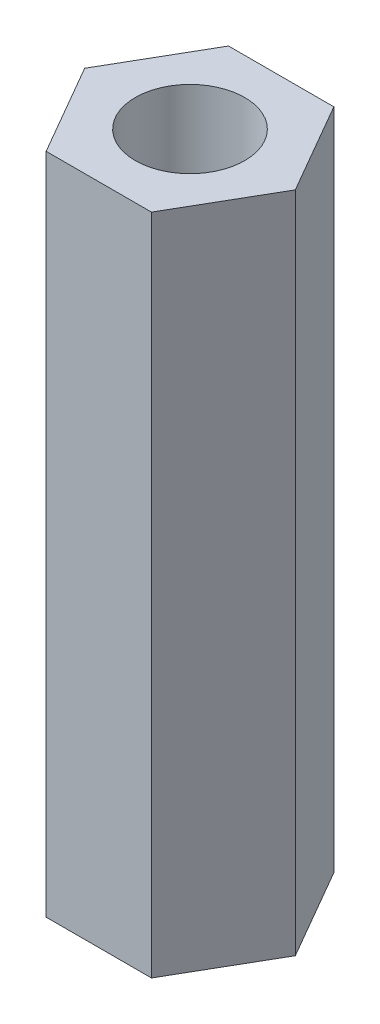
ISO-10303-21;
HEADER;
FILE_DESCRIPTION(('STEP AP214'),'2;1');
FILE_NAME('part.step','',(''),(''),'','','');
FILE_SCHEMA(('AUTOMOTIVE_DESIGN { 1 0 10303 214 1 1 1 1 }'));
ENDSEC;
DATA;
#1=APPLICATION_CONTEXT('core data for automotive mechanical design processes');
#2=APPLICATION_PROTOCOL_DEFINITION('international standard','automotive_design',2000,#1);
#3=PRODUCT_CONTEXT('',#1,'mechanical');
#4=PRODUCT('Part','Part','',(#3));
#5=PRODUCT_RELATED_PRODUCT_CATEGORY('part','',(#4));
#6=PRODUCT_DEFINITION_FORMATION('','',#4);
#7=PRODUCT_DEFINITION_CONTEXT('part definition',#1,'design');
#8=PRODUCT_DEFINITION('design','',#6,#7);
#9=PRODUCT_DEFINITION_SHAPE('','',#8);
#10=(LENGTH_UNIT() NAMED_UNIT(*) SI_UNIT(.MILLI.,.METRE.));
#11=(NAMED_UNIT(*) PLANE_ANGLE_UNIT() SI_UNIT($,.RADIAN.));
#12=(NAMED_UNIT(*) SI_UNIT($,.STERADIAN.) SOLID_ANGLE_UNIT());
#13=UNCERTAINTY_MEASURE_WITH_UNIT(LENGTH_MEASURE(1.E-05),#10,'distance_accuracy_value','');
#14=(GEOMETRIC_REPRESENTATION_CONTEXT(3) GLOBAL_UNCERTAINTY_ASSIGNED_CONTEXT((#13)) GLOBAL_UNIT_ASSIGNED_CONTEXT((#10,
#11,#12)) REPRESENTATION_CONTEXT('',''));
#15=CARTESIAN_POINT('',(0.,0.,0.));
#16=DIRECTION('',(0.,0.,1.));
#17=DIRECTION('',(1.,0.,0.));
#18=AXIS2_PLACEMENT_3D('',#15,#16,#17);
#19=CARTESIAN_POINT('',(0.,20.,0.));
#20=DIRECTION('',(0.,1.,0.));
#21=DIRECTION('',(0.,0.,1.));
#22=AXIS2_PLACEMENT_3D('',#19,#20,#21);
#23=PLANE('',#22);
#24=DIRECTION('',(-0.5,0.,-0.866025403784439));
#25=VECTOR('',#24,1.);
#26=CARTESIAN_POINT('',(3.17542648054294,20.,0.));
#27=LINE('',#26,#25);
#28=CARTESIAN_POINT('',(3.17542648054294,20.,0.));
#29=VERTEX_POINT('',#28);
#30=CARTESIAN_POINT('',(1.58771324027147,20.,-2.75));
#31=VERTEX_POINT('',#30);
#32=EDGE_CURVE('E148',#29,#31,#27,.T.);
#33=ORIENTED_EDGE('',*,*,#32,.T.);
#34=DIRECTION('',(-1.,0.,0.));
#35=VECTOR('',#34,1.);
#36=CARTESIAN_POINT('',(1.58771324027147,20.,-2.75));
#37=LINE('',#36,#35);
#38=CARTESIAN_POINT('',(-1.58771324027147,20.,-2.75));
#39=VERTEX_POINT('',#38);
#40=EDGE_CURVE('E96',#31,#39,#37,.T.);
#41=ORIENTED_EDGE('',*,*,#40,.T.);
#42=DIRECTION('',(-0.5,0.,0.866025403784439));
#43=VECTOR('',#42,1.);
#44=CARTESIAN_POINT('',(-1.58771324027147,20.,-2.75));
#45=LINE('',#44,#43);
#46=CARTESIAN_POINT('',(-3.17542648054294,20.,0.));
#47=VERTEX_POINT('',#46);
#48=EDGE_CURVE('E109',#39,#47,#45,.T.);
#49=ORIENTED_EDGE('',*,*,#48,.T.);
#50=DIRECTION('',(0.5,0.,0.866025403784438));
#51=VECTOR('',#50,1.);
#52=CARTESIAN_POINT('',(-3.17542648054294,20.,0.));
#53=LINE('',#52,#51);
#54=CARTESIAN_POINT('',(-1.58771324027147,20.,2.75));
#55=VERTEX_POINT('',#54);
#56=EDGE_CURVE('E103',#47,#55,#53,.T.);
#57=ORIENTED_EDGE('',*,*,#56,.T.);
#58=DIRECTION('',(1.,0.,0.));
#59=VECTOR('',#58,1.);
#60=CARTESIAN_POINT('',(-1.58771324027147,20.,2.75));
#61=LINE('',#60,#59);
#62=CARTESIAN_POINT('',(1.58771324027147,20.,2.75));
#63=VERTEX_POINT('',#62);
#64=EDGE_CURVE('E107',#55,#63,#61,.T.);
#65=ORIENTED_EDGE('',*,*,#64,.T.);
#66=DIRECTION('',(0.5,0.,-0.866025403784439));
#67=VECTOR('',#66,1.);
#68=CARTESIAN_POINT('',(1.58771324027147,20.,2.75));
#69=LINE('',#68,#67);
#70=EDGE_CURVE('E59',#63,#29,#69,.T.);
#71=ORIENTED_EDGE('',*,*,#70,.T.);
#72=EDGE_LOOP('',(#33,#41,#49,#57,#65,#71));
#73=FACE_BOUND('',#72,.T.);
#74=CARTESIAN_POINT('',(0.,20.,0.));
#75=DIRECTION('',(0.,1.,0.));
#76=DIRECTION('',(0.,0.,1.));
#77=AXIS2_PLACEMENT_3D('',#74,#75,#76);
#78=CIRCLE('',#77,1.65);
#79=CARTESIAN_POINT('',(0.,20.,1.65));
#80=VERTEX_POINT('',#79);
#81=EDGE_CURVE('E136',#80,#80,#78,.T.);
#82=ORIENTED_EDGE('',*,*,#81,.F.);
#83=EDGE_LOOP('',(#82));
#84=FACE_BOUND('',#83,.T.);
#85=ADVANCED_FACE('F41',(#73,#84),#23,.T.);
#86=CARTESIAN_POINT('',(0.,0.,0.));
#87=DIRECTION('',(0.,1.,0.));
#88=DIRECTION('',(0.,0.,1.));
#89=AXIS2_PLACEMENT_3D('',#86,#87,#88);
#90=PLANE('',#89);
#91=DIRECTION('',(-0.5,0.,-0.866025403784439));
#92=VECTOR('',#91,1.);
#93=CARTESIAN_POINT('',(3.17542648054294,0.,0.));
#94=LINE('',#93,#92);
#95=CARTESIAN_POINT('',(3.17542648054294,0.,0.));
#96=VERTEX_POINT('',#95);
#97=CARTESIAN_POINT('',(1.58771324027147,0.,-2.75));
#98=VERTEX_POINT('',#97);
#99=EDGE_CURVE('E131',#96,#98,#94,.T.);
#100=ORIENTED_EDGE('',*,*,#99,.F.);
#101=DIRECTION('',(0.5,0.,-0.866025403784439));
#102=VECTOR('',#101,1.);
#103=CARTESIAN_POINT('',(1.58771324027147,0.,2.75));
#104=LINE('',#103,#102);
#105=CARTESIAN_POINT('',(1.58771324027147,0.,2.75));
#106=VERTEX_POINT('',#105);
#107=EDGE_CURVE('E88',#106,#96,#104,.T.);
#108=ORIENTED_EDGE('',*,*,#107,.F.);
#109=DIRECTION('',(1.,0.,0.));
#110=VECTOR('',#109,1.);
#111=CARTESIAN_POINT('',(-1.58771324027147,0.,2.75));
#112=LINE('',#111,#110);
#113=CARTESIAN_POINT('',(-1.58771324027147,0.,2.75));
#114=VERTEX_POINT('',#113);
#115=EDGE_CURVE('E82',#114,#106,#112,.T.);
#116=ORIENTED_EDGE('',*,*,#115,.F.);
#117=DIRECTION('',(0.5,0.,0.866025403784438));
#118=VECTOR('',#117,1.);
#119=CARTESIAN_POINT('',(-3.17542648054294,0.,0.));
#120=LINE('',#119,#118);
#121=CARTESIAN_POINT('',(-3.17542648054294,0.,0.));
#122=VERTEX_POINT('',#121);
#123=EDGE_CURVE('E118',#122,#114,#120,.T.);
#124=ORIENTED_EDGE('',*,*,#123,.F.);
#125=DIRECTION('',(-0.5,0.,0.866025403784439));
#126=VECTOR('',#125,1.);
#127=CARTESIAN_POINT('',(-1.58771324027147,0.,-2.75));
#128=LINE('',#127,#126);
#129=CARTESIAN_POINT('',(-1.58771324027147,0.,-2.75));
#130=VERTEX_POINT('',#129);
#131=EDGE_CURVE('E139',#130,#122,#128,.T.);
#132=ORIENTED_EDGE('',*,*,#131,.F.);
#133=DIRECTION('',(-1.,0.,0.));
#134=VECTOR('',#133,1.);
#135=CARTESIAN_POINT('',(1.58771324027147,0.,-2.75));
#136=LINE('',#135,#134);
#137=EDGE_CURVE('E135',#98,#130,#136,.T.);
#138=ORIENTED_EDGE('',*,*,#137,.F.);
#139=EDGE_LOOP('',(#100,#108,#116,#124,#132,#138));
#140=FACE_BOUND('',#139,.T.);
#141=CARTESIAN_POINT('',(0.,0.,0.));
#142=DIRECTION('',(0.,1.,0.));
#143=DIRECTION('',(0.,0.,1.));
#144=AXIS2_PLACEMENT_3D('',#141,#142,#143);
#145=CIRCLE('',#144,1.65);
#146=CARTESIAN_POINT('',(0.,0.,1.65));
#147=VERTEX_POINT('',#146);
#148=EDGE_CURVE('E247',#147,#147,#145,.T.);
#149=ORIENTED_EDGE('',*,*,#148,.T.);
#150=EDGE_LOOP('',(#149));
#151=FACE_BOUND('',#150,.T.);
#152=ADVANCED_FACE('F161',(#140,#151),#90,.F.);
#153=CARTESIAN_POINT('',(3.17542648054294,20.,0.));
#154=DIRECTION('',(-0.866025403784438,0.,0.5));
#155=DIRECTION('',(0.5,0.,0.866025403784439));
#156=AXIS2_PLACEMENT_3D('',#153,#154,#155);
#157=PLANE('',#156);
#158=ORIENTED_EDGE('',*,*,#99,.T.);
#159=DIRECTION('',(0.,-1.,0.));
#160=VECTOR('',#159,1.);
#161=CARTESIAN_POINT('',(1.58771324027147,20.,-2.75));
#162=LINE('',#161,#160);
#163=EDGE_CURVE('E11',#31,#98,#162,.T.);
#164=ORIENTED_EDGE('',*,*,#163,.F.);
#165=ORIENTED_EDGE('',*,*,#32,.F.);
#166=DIRECTION('',(0.,-1.,0.));
#167=VECTOR('',#166,1.);
#168=CARTESIAN_POINT('',(3.17542648054294,20.,0.));
#169=LINE('',#168,#167);
#170=EDGE_CURVE('E127',#29,#96,#169,.T.);
#171=ORIENTED_EDGE('',*,*,#170,.T.);
#172=EDGE_LOOP('',(#158,#164,#165,#171));
#173=FACE_BOUND('',#172,.T.);
#174=ADVANCED_FACE('F43',(#173),#157,.F.);
#175=CARTESIAN_POINT('',(1.58771324027147,20.,-2.75));
#176=DIRECTION('',(0.,0.,1.));
#177=DIRECTION('',(1.,0.,0.));
#178=AXIS2_PLACEMENT_3D('',#175,#176,#177);
#179=PLANE('',#178);
#180=ORIENTED_EDGE('',*,*,#137,.T.);
#181=DIRECTION('',(0.,-1.,0.));
#182=VECTOR('',#181,1.);
#183=CARTESIAN_POINT('',(-1.58771324027147,20.,-2.75));
#184=LINE('',#183,#182);
#185=EDGE_CURVE('E51',#39,#130,#184,.T.);
#186=ORIENTED_EDGE('',*,*,#185,.F.);
#187=ORIENTED_EDGE('',*,*,#40,.F.);
#188=ORIENTED_EDGE('',*,*,#163,.T.);
#189=EDGE_LOOP('',(#180,#186,#187,#188));
#190=FACE_BOUND('',#189,.T.);
#191=ADVANCED_FACE('F186',(#190),#179,.F.);
#192=CARTESIAN_POINT('',(-1.58771324027147,20.,-2.75));
#193=DIRECTION('',(0.866025403784439,0.,0.5));
#194=DIRECTION('',(0.5,0.,-0.866025403784439));
#195=AXIS2_PLACEMENT_3D('',#192,#193,#194);
#196=PLANE('',#195);
#197=ORIENTED_EDGE('',*,*,#131,.T.);
#198=DIRECTION('',(0.,-1.,0.));
#199=VECTOR('',#198,1.);
#200=CARTESIAN_POINT('',(-3.17542648054294,20.,0.));
#201=LINE('',#200,#199);
#202=EDGE_CURVE('E120',#47,#122,#201,.T.);
#203=ORIENTED_EDGE('',*,*,#202,.F.);
#204=ORIENTED_EDGE('',*,*,#48,.F.);
#205=ORIENTED_EDGE('',*,*,#185,.T.);
#206=EDGE_LOOP('',(#197,#203,#204,#205));
#207=FACE_BOUND('',#206,.T.);
#208=ADVANCED_FACE('F158',(#207),#196,.F.);
#209=CARTESIAN_POINT('',(-3.17542648054294,20.,0.));
#210=DIRECTION('',(0.866025403784439,0.,-0.5));
#211=DIRECTION('',(-0.5,0.,-0.866025403784439));
#212=AXIS2_PLACEMENT_3D('',#209,#210,#211);
#213=PLANE('',#212);
#214=ORIENTED_EDGE('',*,*,#123,.T.);
#215=DIRECTION('',(0.,-1.,0.));
#216=VECTOR('',#215,1.);
#217=CARTESIAN_POINT('',(-1.58771324027147,20.,2.75));
#218=LINE('',#217,#216);
#219=EDGE_CURVE('E115',#55,#114,#218,.T.);
#220=ORIENTED_EDGE('',*,*,#219,.F.);
#221=ORIENTED_EDGE('',*,*,#56,.F.);
#222=ORIENTED_EDGE('',*,*,#202,.T.);
#223=EDGE_LOOP('',(#214,#220,#221,#222));
#224=FACE_BOUND('',#223,.T.);
#225=ADVANCED_FACE('F116',(#224),#213,.F.);
#226=CARTESIAN_POINT('',(-1.58771324027147,20.,2.75));
#227=DIRECTION('',(0.,0.,-1.));
#228=DIRECTION('',(-1.,0.,0.));
#229=AXIS2_PLACEMENT_3D('',#226,#227,#228);
#230=PLANE('',#229);
#231=ORIENTED_EDGE('',*,*,#115,.T.);
#232=DIRECTION('',(0.,-1.,0.));
#233=VECTOR('',#232,1.);
#234=CARTESIAN_POINT('',(1.58771324027147,20.,2.75));
#235=LINE('',#234,#233);
#236=EDGE_CURVE('E121',#63,#106,#235,.T.);
#237=ORIENTED_EDGE('',*,*,#236,.F.);
#238=ORIENTED_EDGE('',*,*,#64,.F.);
#239=ORIENTED_EDGE('',*,*,#219,.T.);
#240=EDGE_LOOP('',(#231,#237,#238,#239));
#241=FACE_BOUND('',#240,.T.);
#242=ADVANCED_FACE('F123',(#241),#230,.F.);
#243=CARTESIAN_POINT('',(1.58771324027147,20.,2.75));
#244=DIRECTION('',(-0.866025403784439,0.,-0.5));
#245=DIRECTION('',(-0.5,0.,0.866025403784439));
#246=AXIS2_PLACEMENT_3D('',#243,#244,#245);
#247=PLANE('',#246);
#248=ORIENTED_EDGE('',*,*,#107,.T.);
#249=ORIENTED_EDGE('',*,*,#170,.F.);
#250=ORIENTED_EDGE('',*,*,#70,.F.);
#251=ORIENTED_EDGE('',*,*,#236,.T.);
#252=EDGE_LOOP('',(#248,#249,#250,#251));
#253=FACE_BOUND('',#252,.T.);
#254=ADVANCED_FACE('F166',(#253),#247,.F.);
#255=CARTESIAN_POINT('',(0.,20.,0.));
#256=DIRECTION('',(0.,-1.,0.));
#257=DIRECTION('',(0.,0.,-1.));
#258=AXIS2_PLACEMENT_3D('',#255,#256,#257);
#259=CYLINDRICAL_SURFACE('',#258,1.65);
#260=ORIENTED_EDGE('',*,*,#81,.T.);
#261=EDGE_LOOP('',(#260));
#262=FACE_BOUND('',#261,.T.);
#263=ORIENTED_EDGE('',*,*,#148,.F.);
#264=EDGE_LOOP('',(#263));
#265=FACE_BOUND('',#264,.T.);
#266=ADVANCED_FACE('F168',(#262,#265),#259,.F.);
#267=CLOSED_SHELL('',(#85,#152,#174,#191,#208,#225,#242,#254,#266));
#268=MANIFOLD_SOLID_BREP('B2',#267);
#269=ADVANCED_BREP_SHAPE_REPRESENTATION('',(#18,#268),#14);
#270=SHAPE_DEFINITION_REPRESENTATION(#9,#269);
ENDSEC;
END-ISO-10303-21;
